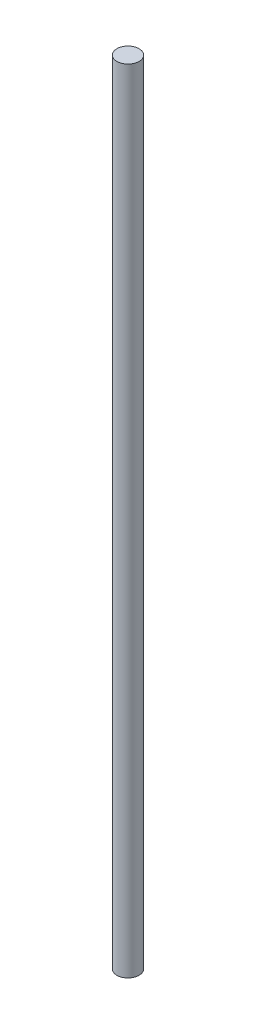
ISO-10303-21;
HEADER;
FILE_DESCRIPTION(('STEP AP214'),'2;1');
FILE_NAME('part.step','',(''),(''),'','','');
FILE_SCHEMA(('AUTOMOTIVE_DESIGN { 1 0 10303 214 1 1 1 1 }'));
ENDSEC;
DATA;
#1=APPLICATION_CONTEXT('core data for automotive mechanical design processes');
#2=APPLICATION_PROTOCOL_DEFINITION('international standard','automotive_design',2000,#1);
#3=PRODUCT_CONTEXT('',#1,'mechanical');
#4=PRODUCT('Part','Part','',(#3));
#5=PRODUCT_RELATED_PRODUCT_CATEGORY('part','',(#4));
#6=PRODUCT_DEFINITION_FORMATION('','',#4);
#7=PRODUCT_DEFINITION_CONTEXT('part definition',#1,'design');
#8=PRODUCT_DEFINITION('design','',#6,#7);
#9=PRODUCT_DEFINITION_SHAPE('','',#8);
#10=(LENGTH_UNIT() NAMED_UNIT(*) SI_UNIT(.MILLI.,.METRE.));
#11=(NAMED_UNIT(*) PLANE_ANGLE_UNIT() SI_UNIT($,.RADIAN.));
#12=(NAMED_UNIT(*) SI_UNIT($,.STERADIAN.) SOLID_ANGLE_UNIT());
#13=UNCERTAINTY_MEASURE_WITH_UNIT(LENGTH_MEASURE(1.E-05),#10,'distance_accuracy_value','');
#14=(GEOMETRIC_REPRESENTATION_CONTEXT(3) GLOBAL_UNCERTAINTY_ASSIGNED_CONTEXT((#13)) GLOBAL_UNIT_ASSIGNED_CONTEXT((#10,
#11,#12)) REPRESENTATION_CONTEXT('',''));
#15=CARTESIAN_POINT('',(0.,0.,0.));
#16=DIRECTION('',(0.,0.,1.));
#17=DIRECTION('',(1.,0.,0.));
#18=AXIS2_PLACEMENT_3D('',#15,#16,#17);
#19=CARTESIAN_POINT('',(0.,1000.,0.));
#20=DIRECTION('',(0.,-1.,0.));
#21=DIRECTION('',(0.,0.,-1.));
#22=AXIS2_PLACEMENT_3D('',#19,#20,#21);
#23=CYLINDRICAL_SURFACE('',#22,14.);
#24=CARTESIAN_POINT('',(0.,1000.,0.));
#25=DIRECTION('',(0.,1.,0.));
#26=DIRECTION('',(0.,0.,1.));
#27=AXIS2_PLACEMENT_3D('',#24,#25,#26);
#28=CIRCLE('',#27,14.);
#29=CARTESIAN_POINT('',(0.,1000.,14.));
#30=VERTEX_POINT('',#29);
#31=EDGE_CURVE('E10',#30,#30,#28,.T.);
#32=ORIENTED_EDGE('',*,*,#31,.F.);
#33=EDGE_LOOP('',(#32));
#34=FACE_BOUND('',#33,.T.);
#35=CARTESIAN_POINT('',(0.,0.,0.));
#36=DIRECTION('',(0.,1.,0.));
#37=DIRECTION('',(0.,0.,1.));
#38=AXIS2_PLACEMENT_3D('',#35,#36,#37);
#39=CIRCLE('',#38,14.);
#40=CARTESIAN_POINT('',(0.,0.,14.));
#41=VERTEX_POINT('',#40);
#42=EDGE_CURVE('E36',#41,#41,#39,.T.);
#43=ORIENTED_EDGE('',*,*,#42,.T.);
#44=EDGE_LOOP('',(#43));
#45=FACE_BOUND('',#44,.T.);
#46=ADVANCED_FACE('F33',(#34,#45),#23,.T.);
#47=CARTESIAN_POINT('',(0.,1000.,0.));
#48=DIRECTION('',(0.,1.,0.));
#49=DIRECTION('',(0.,0.,1.));
#50=AXIS2_PLACEMENT_3D('',#47,#48,#49);
#51=PLANE('',#50);
#52=ORIENTED_EDGE('',*,*,#31,.T.);
#53=EDGE_LOOP('',(#52));
#54=FACE_BOUND('',#53,.T.);
#55=ADVANCED_FACE('F48',(#54),#51,.T.);
#56=CARTESIAN_POINT('',(0.,0.,0.));
#57=DIRECTION('',(0.,1.,0.));
#58=DIRECTION('',(0.,0.,1.));
#59=AXIS2_PLACEMENT_3D('',#56,#57,#58);
#60=PLANE('',#59);
#61=ORIENTED_EDGE('',*,*,#42,.F.);
#62=EDGE_LOOP('',(#61));
#63=FACE_BOUND('',#62,.T.);
#64=ADVANCED_FACE('F46',(#63),#60,.F.);
#65=CLOSED_SHELL('',(#46,#55,#64));
#66=MANIFOLD_SOLID_BREP('B2',#65);
#67=ADVANCED_BREP_SHAPE_REPRESENTATION('',(#18,#66),#14);
#68=SHAPE_DEFINITION_REPRESENTATION(#9,#67);
ENDSEC;
END-ISO-10303-21;
